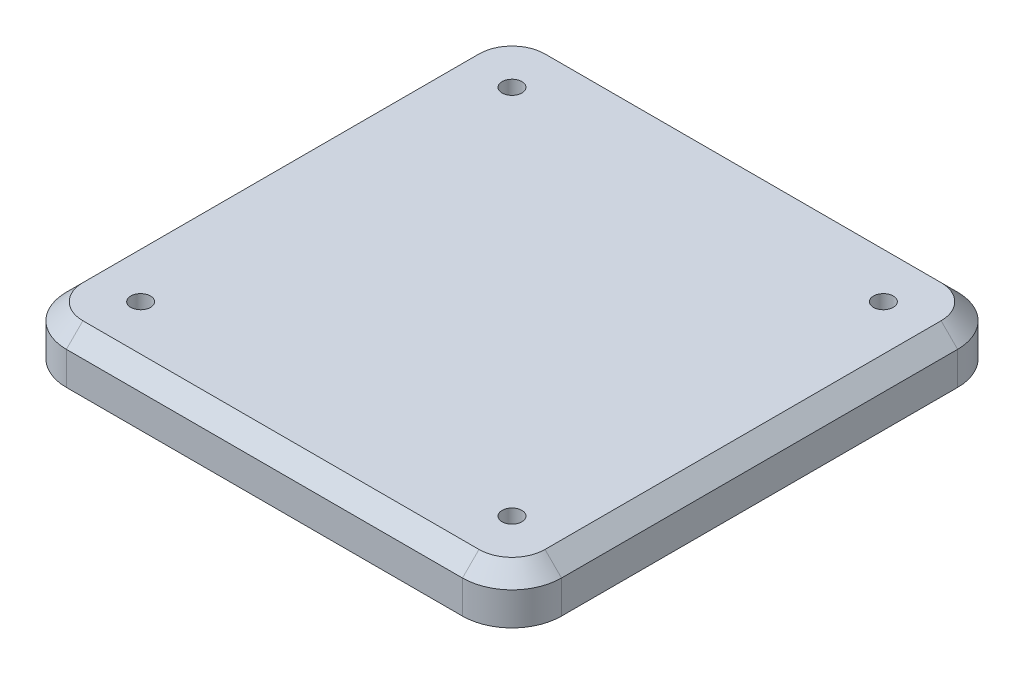
ISO-10303-21;
HEADER;
FILE_DESCRIPTION(('STEP AP214'),'2;1');
FILE_NAME('part.step','',(''),(''),'','','');
FILE_SCHEMA(('AUTOMOTIVE_DESIGN { 1 0 10303 214 1 1 1 1 }'));
ENDSEC;
DATA;
#1=APPLICATION_CONTEXT('core data for automotive mechanical design processes');
#2=APPLICATION_PROTOCOL_DEFINITION('international standard','automotive_design',2000,#1);
#3=PRODUCT_CONTEXT('',#1,'mechanical');
#4=PRODUCT('Part','Part','',(#3));
#5=PRODUCT_RELATED_PRODUCT_CATEGORY('part','',(#4));
#6=PRODUCT_DEFINITION_FORMATION('','',#4);
#7=PRODUCT_DEFINITION_CONTEXT('part definition',#1,'design');
#8=PRODUCT_DEFINITION('design','',#6,#7);
#9=PRODUCT_DEFINITION_SHAPE('','',#8);
#10=(LENGTH_UNIT() NAMED_UNIT(*) SI_UNIT(.MILLI.,.METRE.));
#11=(NAMED_UNIT(*) PLANE_ANGLE_UNIT() SI_UNIT($,.RADIAN.));
#12=(NAMED_UNIT(*) SI_UNIT($,.STERADIAN.) SOLID_ANGLE_UNIT());
#13=UNCERTAINTY_MEASURE_WITH_UNIT(LENGTH_MEASURE(1.E-05),#10,'distance_accuracy_value','');
#14=(GEOMETRIC_REPRESENTATION_CONTEXT(3) GLOBAL_UNCERTAINTY_ASSIGNED_CONTEXT((#13)) GLOBAL_UNIT_ASSIGNED_CONTEXT((#10,
#11,#12)) REPRESENTATION_CONTEXT('',''));
#15=CARTESIAN_POINT('',(0.,0.,0.));
#16=DIRECTION('',(0.,0.,1.));
#17=DIRECTION('',(1.,0.,0.));
#18=AXIS2_PLACEMENT_3D('',#15,#16,#17);
#19=CARTESIAN_POINT('',(0.,30.,0.));
#20=DIRECTION('',(0.,-1.,0.));
#21=DIRECTION('',(0.,0.,-1.));
#22=AXIS2_PLACEMENT_3D('',#19,#20,#21);
#23=PLANE('',#22);
#24=CARTESIAN_POINT('',(37.5,30.,-37.5));
#25=DIRECTION('',(0.,1.,0.));
#26=DIRECTION('',(0.,0.,1.));
#27=AXIS2_PLACEMENT_3D('',#24,#25,#26);
#28=CIRCLE('',#27,5.99999999999998);
#29=CARTESIAN_POINT('',(37.5,30.,-31.5));
#30=VERTEX_POINT('',#29);
#31=EDGE_CURVE('E156',#30,#30,#28,.T.);
#32=ORIENTED_EDGE('',*,*,#31,.F.);
#33=EDGE_LOOP('',(#32));
#34=FACE_BOUND('',#33,.T.);
#35=CARTESIAN_POINT('',(37.5,30.,-262.5));
#36=DIRECTION('',(0.,1.,0.));
#37=DIRECTION('',(0.,0.,1.));
#38=AXIS2_PLACEMENT_3D('',#35,#36,#37);
#39=CIRCLE('',#38,5.99999999999998);
#40=CARTESIAN_POINT('',(37.5,30.,-256.5));
#41=VERTEX_POINT('',#40);
#42=EDGE_CURVE('E155',#41,#41,#39,.T.);
#43=ORIENTED_EDGE('',*,*,#42,.F.);
#44=EDGE_LOOP('',(#43));
#45=FACE_BOUND('',#44,.T.);
#46=CARTESIAN_POINT('',(262.5,30.,-262.5));
#47=DIRECTION('',(0.,1.,0.));
#48=DIRECTION('',(0.,0.,1.));
#49=AXIS2_PLACEMENT_3D('',#46,#47,#48);
#50=CIRCLE('',#49,6.00000000000001);
#51=CARTESIAN_POINT('',(262.5,30.,-256.5));
#52=VERTEX_POINT('',#51);
#53=EDGE_CURVE('E166',#52,#52,#50,.T.);
#54=ORIENTED_EDGE('',*,*,#53,.F.);
#55=EDGE_LOOP('',(#54));
#56=FACE_BOUND('',#55,.T.);
#57=CARTESIAN_POINT('',(30.,30.,-270.));
#58=DIRECTION('',(0.,-1.,0.));
#59=DIRECTION('',(0.,0.,-1.));
#60=AXIS2_PLACEMENT_3D('',#57,#58,#59);
#61=CIRCLE('',#60,20.);
#62=CARTESIAN_POINT('',(30.,30.,-290.));
#63=VERTEX_POINT('',#62);
#64=CARTESIAN_POINT('',(9.99999999999995,30.,-270.));
#65=VERTEX_POINT('',#64);
#66=EDGE_CURVE('E252',#63,#65,#61,.F.);
#67=ORIENTED_EDGE('',*,*,#66,.T.);
#68=DIRECTION('',(0.,0.,1.));
#69=VECTOR('',#68,1.);
#70=CARTESIAN_POINT('',(9.99999999999995,30.,0.));
#71=LINE('',#70,#69);
#72=CARTESIAN_POINT('',(9.99999999999995,30.,-30.));
#73=VERTEX_POINT('',#72);
#74=EDGE_CURVE('E256',#65,#73,#71,.T.);
#75=ORIENTED_EDGE('',*,*,#74,.T.);
#76=CARTESIAN_POINT('',(30.,30.,-30.));
#77=DIRECTION('',(0.,-1.,0.));
#78=DIRECTION('',(0.,0.,-1.));
#79=AXIS2_PLACEMENT_3D('',#76,#77,#78);
#80=CIRCLE('',#79,20.);
#81=CARTESIAN_POINT('',(30.,30.,-9.99999999999995));
#82=VERTEX_POINT('',#81);
#83=EDGE_CURVE('E254',#73,#82,#80,.F.);
#84=ORIENTED_EDGE('',*,*,#83,.T.);
#85=DIRECTION('',(1.,0.,0.));
#86=VECTOR('',#85,1.);
#87=CARTESIAN_POINT('',(0.,30.,-9.99999999999995));
#88=LINE('',#87,#86);
#89=CARTESIAN_POINT('',(270.,30.,-9.99999999999998));
#90=VERTEX_POINT('',#89);
#91=EDGE_CURVE('E250',#82,#90,#88,.T.);
#92=ORIENTED_EDGE('',*,*,#91,.T.);
#93=CARTESIAN_POINT('',(270.,30.,-30.));
#94=DIRECTION('',(0.,-1.,0.));
#95=DIRECTION('',(0.,0.,-1.));
#96=AXIS2_PLACEMENT_3D('',#93,#94,#95);
#97=CIRCLE('',#96,20.);
#98=CARTESIAN_POINT('',(290.,30.,-30.));
#99=VERTEX_POINT('',#98);
#100=EDGE_CURVE('E246',#90,#99,#97,.F.);
#101=ORIENTED_EDGE('',*,*,#100,.T.);
#102=DIRECTION('',(0.,0.,-1.));
#103=VECTOR('',#102,1.);
#104=CARTESIAN_POINT('',(290.,30.,0.));
#105=LINE('',#104,#103);
#106=CARTESIAN_POINT('',(290.,30.,-270.));
#107=VERTEX_POINT('',#106);
#108=EDGE_CURVE('E242',#99,#107,#105,.T.);
#109=ORIENTED_EDGE('',*,*,#108,.T.);
#110=CARTESIAN_POINT('',(270.,30.,-270.));
#111=DIRECTION('',(0.,-1.,0.));
#112=DIRECTION('',(0.,0.,-1.));
#113=AXIS2_PLACEMENT_3D('',#110,#111,#112);
#114=CIRCLE('',#113,20.);
#115=CARTESIAN_POINT('',(270.,30.,-290.));
#116=VERTEX_POINT('',#115);
#117=EDGE_CURVE('E244',#107,#116,#114,.F.);
#118=ORIENTED_EDGE('',*,*,#117,.T.);
#119=DIRECTION('',(-1.,0.,0.));
#120=VECTOR('',#119,1.);
#121=CARTESIAN_POINT('',(0.,30.,-290.));
#122=LINE('',#121,#120);
#123=EDGE_CURVE('E248',#116,#63,#122,.T.);
#124=ORIENTED_EDGE('',*,*,#123,.T.);
#125=EDGE_LOOP('',(#67,#75,#84,#92,#101,#109,#118,#124));
#126=FACE_BOUND('',#125,.T.);
#127=CARTESIAN_POINT('',(262.5,30.,-37.5));
#128=DIRECTION('',(0.,1.,0.));
#129=DIRECTION('',(0.,0.,1.));
#130=AXIS2_PLACEMENT_3D('',#127,#128,#129);
#131=CIRCLE('',#130,6.00000000000001);
#132=CARTESIAN_POINT('',(262.5,30.,-31.5));
#133=VERTEX_POINT('',#132);
#134=EDGE_CURVE('E172',#133,#133,#131,.T.);
#135=ORIENTED_EDGE('',*,*,#134,.F.);
#136=EDGE_LOOP('',(#135));
#137=FACE_BOUND('',#136,.T.);
#138=ADVANCED_FACE('F33',(#34,#45,#56,#126,#137),#23,.F.);
#139=CARTESIAN_POINT('',(0.,30.,0.));
#140=DIRECTION('',(1.,0.,0.));
#141=DIRECTION('',(0.,0.,-1.));
#142=AXIS2_PLACEMENT_3D('',#139,#140,#141);
#143=PLANE('',#142);
#144=DIRECTION('',(0.,-1.,0.));
#145=VECTOR('',#144,1.);
#146=CARTESIAN_POINT('',(0.,30.,-30.));
#147=LINE('',#146,#145);
#148=CARTESIAN_POINT('',(0.,0.,-30.));
#149=VERTEX_POINT('',#148);
#150=CARTESIAN_POINT('',(0.,20.,-30.));
#151=VERTEX_POINT('',#150);
#152=EDGE_CURVE('E215',#149,#151,#147,.F.);
#153=ORIENTED_EDGE('',*,*,#152,.T.);
#154=DIRECTION('',(0.,0.,-1.));
#155=VECTOR('',#154,1.);
#156=CARTESIAN_POINT('',(0.,20.,0.));
#157=LINE('',#156,#155);
#158=CARTESIAN_POINT('',(0.,20.,-270.));
#159=VERTEX_POINT('',#158);
#160=EDGE_CURVE('E259',#151,#159,#157,.T.);
#161=ORIENTED_EDGE('',*,*,#160,.T.);
#162=DIRECTION('',(0.,-1.,0.));
#163=VECTOR('',#162,1.);
#164=CARTESIAN_POINT('',(0.,30.,-270.));
#165=LINE('',#164,#163);
#166=CARTESIAN_POINT('',(0.,0.,-270.));
#167=VERTEX_POINT('',#166);
#168=EDGE_CURVE('E218',#159,#167,#165,.T.);
#169=ORIENTED_EDGE('',*,*,#168,.T.);
#170=DIRECTION('',(0.,0.,1.));
#171=VECTOR('',#170,1.);
#172=CARTESIAN_POINT('',(0.,0.,0.));
#173=LINE('',#172,#171);
#174=EDGE_CURVE('E203',#167,#149,#173,.T.);
#175=ORIENTED_EDGE('',*,*,#174,.T.);
#176=EDGE_LOOP('',(#153,#161,#169,#175));
#177=FACE_BOUND('',#176,.T.);
#178=ADVANCED_FACE('F338',(#177),#143,.F.);
#179=CARTESIAN_POINT('',(0.,30.,0.));
#180=DIRECTION('',(0.,0.,-1.));
#181=DIRECTION('',(-1.,0.,0.));
#182=AXIS2_PLACEMENT_3D('',#179,#180,#181);
#183=PLANE('',#182);
#184=DIRECTION('',(0.,-1.,0.));
#185=VECTOR('',#184,1.);
#186=CARTESIAN_POINT('',(270.,30.,0.));
#187=LINE('',#186,#185);
#188=CARTESIAN_POINT('',(270.,0.,0.));
#189=VERTEX_POINT('',#188);
#190=CARTESIAN_POINT('',(270.,20.,0.));
#191=VERTEX_POINT('',#190);
#192=EDGE_CURVE('E239',#189,#191,#187,.F.);
#193=ORIENTED_EDGE('',*,*,#192,.T.);
#194=DIRECTION('',(-1.,0.,0.));
#195=VECTOR('',#194,1.);
#196=CARTESIAN_POINT('',(0.,20.,0.));
#197=LINE('',#196,#195);
#198=CARTESIAN_POINT('',(30.,20.,0.));
#199=VERTEX_POINT('',#198);
#200=EDGE_CURVE('E266',#191,#199,#197,.T.);
#201=ORIENTED_EDGE('',*,*,#200,.T.);
#202=DIRECTION('',(0.,-1.,0.));
#203=VECTOR('',#202,1.);
#204=CARTESIAN_POINT('',(30.,30.,0.));
#205=LINE('',#204,#203);
#206=CARTESIAN_POINT('',(30.,0.,0.));
#207=VERTEX_POINT('',#206);
#208=EDGE_CURVE('E237',#199,#207,#205,.T.);
#209=ORIENTED_EDGE('',*,*,#208,.T.);
#210=DIRECTION('',(1.,0.,0.));
#211=VECTOR('',#210,1.);
#212=CARTESIAN_POINT('',(0.,0.,0.));
#213=LINE('',#212,#211);
#214=EDGE_CURVE('E206',#207,#189,#213,.T.);
#215=ORIENTED_EDGE('',*,*,#214,.T.);
#216=EDGE_LOOP('',(#193,#201,#209,#215));
#217=FACE_BOUND('',#216,.T.);
#218=ADVANCED_FACE('F309',(#217),#183,.F.);
#219=CARTESIAN_POINT('',(300.,30.,0.));
#220=DIRECTION('',(-1.,0.,0.));
#221=DIRECTION('',(0.,0.,1.));
#222=AXIS2_PLACEMENT_3D('',#219,#220,#221);
#223=PLANE('',#222);
#224=DIRECTION('',(0.,-1.,0.));
#225=VECTOR('',#224,1.);
#226=CARTESIAN_POINT('',(300.,30.,-270.));
#227=LINE('',#226,#225);
#228=CARTESIAN_POINT('',(300.,0.,-270.));
#229=VERTEX_POINT('',#228);
#230=CARTESIAN_POINT('',(300.,20.,-270.));
#231=VERTEX_POINT('',#230);
#232=EDGE_CURVE('E235',#229,#231,#227,.F.);
#233=ORIENTED_EDGE('',*,*,#232,.T.);
#234=DIRECTION('',(0.,0.,1.));
#235=VECTOR('',#234,1.);
#236=CARTESIAN_POINT('',(300.,20.,0.));
#237=LINE('',#236,#235);
#238=CARTESIAN_POINT('',(300.,20.,-30.));
#239=VERTEX_POINT('',#238);
#240=EDGE_CURVE('E11',#231,#239,#237,.T.);
#241=ORIENTED_EDGE('',*,*,#240,.T.);
#242=DIRECTION('',(0.,-1.,0.));
#243=VECTOR('',#242,1.);
#244=CARTESIAN_POINT('',(300.,30.,-30.));
#245=LINE('',#244,#243);
#246=CARTESIAN_POINT('',(300.,0.,-30.));
#247=VERTEX_POINT('',#246);
#248=EDGE_CURVE('E233',#239,#247,#245,.T.);
#249=ORIENTED_EDGE('',*,*,#248,.T.);
#250=DIRECTION('',(0.,0.,-1.));
#251=VECTOR('',#250,1.);
#252=CARTESIAN_POINT('',(300.,0.,0.));
#253=LINE('',#252,#251);
#254=EDGE_CURVE('E209',#247,#229,#253,.T.);
#255=ORIENTED_EDGE('',*,*,#254,.T.);
#256=EDGE_LOOP('',(#233,#241,#249,#255));
#257=FACE_BOUND('',#256,.T.);
#258=ADVANCED_FACE('F319',(#257),#223,.F.);
#259=CARTESIAN_POINT('',(0.,30.,-300.));
#260=DIRECTION('',(0.,0.,1.));
#261=DIRECTION('',(1.,0.,0.));
#262=AXIS2_PLACEMENT_3D('',#259,#260,#261);
#263=PLANE('',#262);
#264=DIRECTION('',(0.,-1.,0.));
#265=VECTOR('',#264,1.);
#266=CARTESIAN_POINT('',(30.,30.,-300.));
#267=LINE('',#266,#265);
#268=CARTESIAN_POINT('',(30.,0.,-300.));
#269=VERTEX_POINT('',#268);
#270=CARTESIAN_POINT('',(30.,20.,-300.));
#271=VERTEX_POINT('',#270);
#272=EDGE_CURVE('E230',#269,#271,#267,.F.);
#273=ORIENTED_EDGE('',*,*,#272,.T.);
#274=DIRECTION('',(1.,0.,0.));
#275=VECTOR('',#274,1.);
#276=CARTESIAN_POINT('',(0.,20.,-300.));
#277=LINE('',#276,#275);
#278=CARTESIAN_POINT('',(270.,20.,-300.));
#279=VERTEX_POINT('',#278);
#280=EDGE_CURVE('E268',#271,#279,#277,.T.);
#281=ORIENTED_EDGE('',*,*,#280,.T.);
#282=DIRECTION('',(0.,-1.,0.));
#283=VECTOR('',#282,1.);
#284=CARTESIAN_POINT('',(270.,30.,-300.));
#285=LINE('',#284,#283);
#286=CARTESIAN_POINT('',(270.,0.,-300.));
#287=VERTEX_POINT('',#286);
#288=EDGE_CURVE('E228',#279,#287,#285,.T.);
#289=ORIENTED_EDGE('',*,*,#288,.T.);
#290=DIRECTION('',(-1.,0.,0.));
#291=VECTOR('',#290,1.);
#292=CARTESIAN_POINT('',(0.,0.,-300.));
#293=LINE('',#292,#291);
#294=EDGE_CURVE('E212',#287,#269,#293,.T.);
#295=ORIENTED_EDGE('',*,*,#294,.T.);
#296=EDGE_LOOP('',(#273,#281,#289,#295));
#297=FACE_BOUND('',#296,.T.);
#298=ADVANCED_FACE('F324',(#297),#263,.F.);
#299=CARTESIAN_POINT('',(0.,0.,0.));
#300=DIRECTION('',(0.,-1.,0.));
#301=DIRECTION('',(0.,0.,-1.));
#302=AXIS2_PLACEMENT_3D('',#299,#300,#301);
#303=PLANE('',#302);
#304=CARTESIAN_POINT('',(25.,0.,-25.));
#305=DIRECTION('',(0.,-1.,0.));
#306=DIRECTION('',(0.,0.,-1.));
#307=AXIS2_PLACEMENT_3D('',#304,#305,#306);
#308=CIRCLE('',#307,5.99999999999999);
#309=CARTESIAN_POINT('',(25.,0.,-31.));
#310=VERTEX_POINT('',#309);
#311=EDGE_CURVE('E178',#310,#310,#308,.T.);
#312=ORIENTED_EDGE('',*,*,#311,.F.);
#313=EDGE_LOOP('',(#312));
#314=FACE_BOUND('',#313,.T.);
#315=CARTESIAN_POINT('',(275.,0.,-25.));
#316=DIRECTION('',(0.,-1.,0.));
#317=DIRECTION('',(0.,0.,-1.));
#318=AXIS2_PLACEMENT_3D('',#315,#316,#317);
#319=CIRCLE('',#318,6.00000000000001);
#320=CARTESIAN_POINT('',(275.,0.,-31.));
#321=VERTEX_POINT('',#320);
#322=EDGE_CURVE('E184',#321,#321,#319,.T.);
#323=ORIENTED_EDGE('',*,*,#322,.F.);
#324=EDGE_LOOP('',(#323));
#325=FACE_BOUND('',#324,.T.);
#326=CARTESIAN_POINT('',(275.,0.,-275.));
#327=DIRECTION('',(0.,-1.,0.));
#328=DIRECTION('',(0.,0.,-1.));
#329=AXIS2_PLACEMENT_3D('',#326,#327,#328);
#330=CIRCLE('',#329,6.00000000000001);
#331=CARTESIAN_POINT('',(275.,0.,-281.));
#332=VERTEX_POINT('',#331);
#333=EDGE_CURVE('E190',#332,#332,#330,.T.);
#334=ORIENTED_EDGE('',*,*,#333,.F.);
#335=EDGE_LOOP('',(#334));
#336=FACE_BOUND('',#335,.T.);
#337=CARTESIAN_POINT('',(25.,0.,-275.));
#338=DIRECTION('',(0.,-1.,0.));
#339=DIRECTION('',(0.,0.,-1.));
#340=AXIS2_PLACEMENT_3D('',#337,#338,#339);
#341=CIRCLE('',#340,5.99999999999999);
#342=CARTESIAN_POINT('',(25.,0.,-281.));
#343=VERTEX_POINT('',#342);
#344=EDGE_CURVE('E196',#343,#343,#341,.T.);
#345=ORIENTED_EDGE('',*,*,#344,.F.);
#346=EDGE_LOOP('',(#345));
#347=FACE_BOUND('',#346,.T.);
#348=ORIENTED_EDGE('',*,*,#174,.F.);
#349=CARTESIAN_POINT('',(30.,0.,-270.));
#350=DIRECTION('',(0.,-1.,0.));
#351=DIRECTION('',(0.,0.,-1.));
#352=AXIS2_PLACEMENT_3D('',#349,#350,#351);
#353=CIRCLE('',#352,30.);
#354=EDGE_CURVE('E226',#167,#269,#353,.T.);
#355=ORIENTED_EDGE('',*,*,#354,.T.);
#356=ORIENTED_EDGE('',*,*,#294,.F.);
#357=CARTESIAN_POINT('',(270.,0.,-270.));
#358=DIRECTION('',(0.,-1.,0.));
#359=DIRECTION('',(0.,0.,-1.));
#360=AXIS2_PLACEMENT_3D('',#357,#358,#359);
#361=CIRCLE('',#360,30.);
#362=EDGE_CURVE('E224',#287,#229,#361,.T.);
#363=ORIENTED_EDGE('',*,*,#362,.T.);
#364=ORIENTED_EDGE('',*,*,#254,.F.);
#365=CARTESIAN_POINT('',(270.,0.,-30.));
#366=DIRECTION('',(0.,-1.,0.));
#367=DIRECTION('',(0.,0.,-1.));
#368=AXIS2_PLACEMENT_3D('',#365,#366,#367);
#369=CIRCLE('',#368,30.);
#370=EDGE_CURVE('E222',#247,#189,#369,.T.);
#371=ORIENTED_EDGE('',*,*,#370,.T.);
#372=ORIENTED_EDGE('',*,*,#214,.F.);
#373=CARTESIAN_POINT('',(30.,0.,-30.));
#374=DIRECTION('',(0.,-1.,0.));
#375=DIRECTION('',(0.,0.,-1.));
#376=AXIS2_PLACEMENT_3D('',#373,#374,#375);
#377=CIRCLE('',#376,30.);
#378=EDGE_CURVE('E220',#207,#149,#377,.T.);
#379=ORIENTED_EDGE('',*,*,#378,.T.);
#380=EDGE_LOOP('',(#348,#355,#356,#363,#364,#371,#372,#379));
#381=FACE_BOUND('',#380,.T.);
#382=ADVANCED_FACE('F315',(#314,#325,#336,#347,#381),#303,.T.);
#383=CARTESIAN_POINT('',(30.,30.,-270.));
#384=DIRECTION('',(0.,-1.,0.));
#385=DIRECTION('',(0.,0.,-1.));
#386=AXIS2_PLACEMENT_3D('',#383,#384,#385);
#387=CYLINDRICAL_SURFACE('',#386,30.);
#388=ORIENTED_EDGE('',*,*,#168,.F.);
#389=CARTESIAN_POINT('',(30.,20.,-270.));
#390=DIRECTION('',(0.,-1.,0.));
#391=DIRECTION('',(0.,0.,-1.));
#392=AXIS2_PLACEMENT_3D('',#389,#390,#391);
#393=CIRCLE('',#392,30.);
#394=EDGE_CURVE('E264',#159,#271,#393,.T.);
#395=ORIENTED_EDGE('',*,*,#394,.T.);
#396=ORIENTED_EDGE('',*,*,#272,.F.);
#397=ORIENTED_EDGE('',*,*,#354,.F.);
#398=EDGE_LOOP('',(#388,#395,#396,#397));
#399=FACE_BOUND('',#398,.T.);
#400=ADVANCED_FACE('F328',(#399),#387,.T.);
#401=CARTESIAN_POINT('',(270.,30.,-270.));
#402=DIRECTION('',(0.,-1.,0.));
#403=DIRECTION('',(0.,0.,-1.));
#404=AXIS2_PLACEMENT_3D('',#401,#402,#403);
#405=CYLINDRICAL_SURFACE('',#404,30.);
#406=ORIENTED_EDGE('',*,*,#288,.F.);
#407=CARTESIAN_POINT('',(270.,20.,-270.));
#408=DIRECTION('',(0.,-1.,0.));
#409=DIRECTION('',(0.,0.,-1.));
#410=AXIS2_PLACEMENT_3D('',#407,#408,#409);
#411=CIRCLE('',#410,30.);
#412=EDGE_CURVE('E42',#279,#231,#411,.T.);
#413=ORIENTED_EDGE('',*,*,#412,.T.);
#414=ORIENTED_EDGE('',*,*,#232,.F.);
#415=ORIENTED_EDGE('',*,*,#362,.F.);
#416=EDGE_LOOP('',(#406,#413,#414,#415));
#417=FACE_BOUND('',#416,.T.);
#418=ADVANCED_FACE('F320',(#417),#405,.T.);
#419=CARTESIAN_POINT('',(270.,30.,-30.));
#420=DIRECTION('',(0.,-1.,0.));
#421=DIRECTION('',(0.,0.,-1.));
#422=AXIS2_PLACEMENT_3D('',#419,#420,#421);
#423=CYLINDRICAL_SURFACE('',#422,30.);
#424=ORIENTED_EDGE('',*,*,#248,.F.);
#425=CARTESIAN_POINT('',(270.,20.,-30.));
#426=DIRECTION('',(0.,-1.,0.));
#427=DIRECTION('',(0.,0.,-1.));
#428=AXIS2_PLACEMENT_3D('',#425,#426,#427);
#429=CIRCLE('',#428,30.);
#430=EDGE_CURVE('E270',#239,#191,#429,.T.);
#431=ORIENTED_EDGE('',*,*,#430,.T.);
#432=ORIENTED_EDGE('',*,*,#192,.F.);
#433=ORIENTED_EDGE('',*,*,#370,.F.);
#434=EDGE_LOOP('',(#424,#431,#432,#433));
#435=FACE_BOUND('',#434,.T.);
#436=ADVANCED_FACE('F306',(#435),#423,.T.);
#437=CARTESIAN_POINT('',(30.,30.,-30.));
#438=DIRECTION('',(0.,-1.,0.));
#439=DIRECTION('',(0.,0.,-1.));
#440=AXIS2_PLACEMENT_3D('',#437,#438,#439);
#441=CYLINDRICAL_SURFACE('',#440,30.);
#442=ORIENTED_EDGE('',*,*,#208,.F.);
#443=CARTESIAN_POINT('',(30.,20.,-30.));
#444=DIRECTION('',(0.,-1.,0.));
#445=DIRECTION('',(0.,0.,-1.));
#446=AXIS2_PLACEMENT_3D('',#443,#444,#445);
#447=CIRCLE('',#446,30.);
#448=EDGE_CURVE('E262',#199,#151,#447,.T.);
#449=ORIENTED_EDGE('',*,*,#448,.T.);
#450=ORIENTED_EDGE('',*,*,#152,.F.);
#451=ORIENTED_EDGE('',*,*,#378,.F.);
#452=EDGE_LOOP('',(#442,#449,#450,#451));
#453=FACE_BOUND('',#452,.T.);
#454=ADVANCED_FACE('F392',(#453),#441,.T.);
#455=CARTESIAN_POINT('',(290.,30.,0.));
#456=DIRECTION('',(-0.707106781186549,-0.707106781186546,0.));
#457=DIRECTION('',(0.,0.,-1.));
#458=AXIS2_PLACEMENT_3D('',#455,#456,#457);
#459=PLANE('',#458);
#460=DIRECTION('',(-0.707106781186546,0.707106781186549,0.));
#461=VECTOR('',#460,1.);
#462=CARTESIAN_POINT('',(300.,20.,-30.));
#463=LINE('',#462,#461);
#464=EDGE_CURVE('E287',#239,#99,#463,.T.);
#465=ORIENTED_EDGE('',*,*,#464,.F.);
#466=ORIENTED_EDGE('',*,*,#240,.F.);
#467=DIRECTION('',(0.707106781186546,-0.707106781186549,0.));
#468=VECTOR('',#467,1.);
#469=CARTESIAN_POINT('',(290.,30.,-270.));
#470=LINE('',#469,#468);
#471=EDGE_CURVE('E37',#107,#231,#470,.T.);
#472=ORIENTED_EDGE('',*,*,#471,.F.);
#473=ORIENTED_EDGE('',*,*,#108,.F.);
#474=EDGE_LOOP('',(#465,#466,#472,#473));
#475=FACE_BOUND('',#474,.T.);
#476=ADVANCED_FACE('F35',(#475),#459,.F.);
#477=CARTESIAN_POINT('',(270.,30.,-270.));
#478=DIRECTION('',(0.,-1.,0.));
#479=DIRECTION('',(0.,0.,-1.));
#480=AXIS2_PLACEMENT_3D('',#477,#478,#479);
#481=CONICAL_SURFACE('',#480,20.,0.785398163397447);
#482=ORIENTED_EDGE('',*,*,#471,.T.);
#483=ORIENTED_EDGE('',*,*,#412,.F.);
#484=DIRECTION('',(0.,-0.707106781186549,-0.707106781186546));
#485=VECTOR('',#484,1.);
#486=CARTESIAN_POINT('',(270.,30.,-290.));
#487=LINE('',#486,#485);
#488=EDGE_CURVE('E285',#116,#279,#487,.T.);
#489=ORIENTED_EDGE('',*,*,#488,.F.);
#490=ORIENTED_EDGE('',*,*,#117,.F.);
#491=EDGE_LOOP('',(#482,#483,#489,#490));
#492=FACE_BOUND('',#491,.T.);
#493=ADVANCED_FACE('F297',(#492),#481,.T.);
#494=CARTESIAN_POINT('',(270.,30.,-30.));
#495=DIRECTION('',(0.,-1.,0.));
#496=DIRECTION('',(0.,0.,-1.));
#497=AXIS2_PLACEMENT_3D('',#494,#495,#496);
#498=CONICAL_SURFACE('',#497,20.,0.785398163397447);
#499=ORIENTED_EDGE('',*,*,#464,.T.);
#500=ORIENTED_EDGE('',*,*,#100,.F.);
#501=DIRECTION('',(0.,0.707106781186548,-0.707106781186546));
#502=VECTOR('',#501,1.);
#503=CARTESIAN_POINT('',(270.,20.,0.));
#504=LINE('',#503,#502);
#505=EDGE_CURVE('E282',#191,#90,#504,.T.);
#506=ORIENTED_EDGE('',*,*,#505,.F.);
#507=ORIENTED_EDGE('',*,*,#430,.F.);
#508=EDGE_LOOP('',(#499,#500,#506,#507));
#509=FACE_BOUND('',#508,.T.);
#510=ADVANCED_FACE('F302',(#509),#498,.T.);
#511=CARTESIAN_POINT('',(0.,30.,-290.));
#512=DIRECTION('',(0.,-0.707106781186546,0.707106781186549));
#513=DIRECTION('',(-1.,0.,0.));
#514=AXIS2_PLACEMENT_3D('',#511,#512,#513);
#515=PLANE('',#514);
#516=ORIENTED_EDGE('',*,*,#488,.T.);
#517=ORIENTED_EDGE('',*,*,#280,.F.);
#518=DIRECTION('',(0.,-0.707106781186549,-0.707106781186546));
#519=VECTOR('',#518,1.);
#520=CARTESIAN_POINT('',(30.,30.,-290.));
#521=LINE('',#520,#519);
#522=EDGE_CURVE('E279',#63,#271,#521,.T.);
#523=ORIENTED_EDGE('',*,*,#522,.F.);
#524=ORIENTED_EDGE('',*,*,#123,.F.);
#525=EDGE_LOOP('',(#516,#517,#523,#524));
#526=FACE_BOUND('',#525,.T.);
#527=ADVANCED_FACE('F353',(#526),#515,.F.);
#528=CARTESIAN_POINT('',(0.,30.,-9.99999999999995));
#529=DIRECTION('',(0.,-0.707106781186546,-0.707106781186549));
#530=DIRECTION('',(1.,0.,0.));
#531=AXIS2_PLACEMENT_3D('',#528,#529,#530);
#532=PLANE('',#531);
#533=ORIENTED_EDGE('',*,*,#505,.T.);
#534=ORIENTED_EDGE('',*,*,#91,.F.);
#535=DIRECTION('',(0.,0.707106781186549,-0.707106781186546));
#536=VECTOR('',#535,1.);
#537=CARTESIAN_POINT('',(30.,20.,0.));
#538=LINE('',#537,#536);
#539=EDGE_CURVE('E276',#199,#82,#538,.T.);
#540=ORIENTED_EDGE('',*,*,#539,.F.);
#541=ORIENTED_EDGE('',*,*,#200,.F.);
#542=EDGE_LOOP('',(#533,#534,#540,#541));
#543=FACE_BOUND('',#542,.T.);
#544=ADVANCED_FACE('F355',(#543),#532,.F.);
#545=CARTESIAN_POINT('',(30.,30.,-270.));
#546=DIRECTION('',(0.,-1.,0.));
#547=DIRECTION('',(0.,0.,-1.));
#548=AXIS2_PLACEMENT_3D('',#545,#546,#547);
#549=CONICAL_SURFACE('',#548,20.,0.785398163397446);
#550=ORIENTED_EDGE('',*,*,#522,.T.);
#551=ORIENTED_EDGE('',*,*,#394,.F.);
#552=DIRECTION('',(-0.707106781186545,-0.70710678118655,0.));
#553=VECTOR('',#552,1.);
#554=CARTESIAN_POINT('',(9.99999999999995,30.,-270.));
#555=LINE('',#554,#553);
#556=EDGE_CURVE('E274',#65,#159,#555,.T.);
#557=ORIENTED_EDGE('',*,*,#556,.F.);
#558=ORIENTED_EDGE('',*,*,#66,.F.);
#559=EDGE_LOOP('',(#550,#551,#557,#558));
#560=FACE_BOUND('',#559,.T.);
#561=ADVANCED_FACE('F332',(#560),#549,.T.);
#562=CARTESIAN_POINT('',(30.,30.,-30.));
#563=DIRECTION('',(0.,-1.,0.));
#564=DIRECTION('',(0.,0.,-1.));
#565=AXIS2_PLACEMENT_3D('',#562,#563,#564);
#566=CONICAL_SURFACE('',#565,20.,0.785398163397446);
#567=ORIENTED_EDGE('',*,*,#539,.T.);
#568=ORIENTED_EDGE('',*,*,#83,.F.);
#569=DIRECTION('',(0.707106781186546,0.707106781186549,0.));
#570=VECTOR('',#569,1.);
#571=CARTESIAN_POINT('',(0.,20.,-30.));
#572=LINE('',#571,#570);
#573=EDGE_CURVE('E202',#151,#73,#572,.T.);
#574=ORIENTED_EDGE('',*,*,#573,.F.);
#575=ORIENTED_EDGE('',*,*,#448,.F.);
#576=EDGE_LOOP('',(#567,#568,#574,#575));
#577=FACE_BOUND('',#576,.T.);
#578=ADVANCED_FACE('F346',(#577),#566,.T.);
#579=CARTESIAN_POINT('',(9.99999999999995,30.,0.));
#580=DIRECTION('',(0.707106781186549,-0.707106781186546,0.));
#581=DIRECTION('',(0.,0.,1.));
#582=AXIS2_PLACEMENT_3D('',#579,#580,#581);
#583=PLANE('',#582);
#584=ORIENTED_EDGE('',*,*,#556,.T.);
#585=ORIENTED_EDGE('',*,*,#160,.F.);
#586=ORIENTED_EDGE('',*,*,#573,.T.);
#587=ORIENTED_EDGE('',*,*,#74,.F.);
#588=EDGE_LOOP('',(#584,#585,#586,#587));
#589=FACE_BOUND('',#588,.T.);
#590=ADVANCED_FACE('F342',(#589),#583,.F.);
#591=CARTESIAN_POINT('',(25.,9.99999999999999,-275.));
#592=DIRECTION('',(0.,-1.,0.));
#593=DIRECTION('',(0.,0.,-1.));
#594=AXIS2_PLACEMENT_3D('',#591,#592,#593);
#595=CONICAL_SURFACE('',#594,5.99999999999999,1.02974425867666);
#596=CARTESIAN_POINT('',(25.,13.6051637141653,-275.));
#597=VERTEX_POINT('',#596);
#598=VERTEX_LOOP('',#597);
#599=FACE_BOUND('',#598,.T.);
#600=CARTESIAN_POINT('',(25.,9.99999999999999,-275.));
#601=DIRECTION('',(0.,-1.,0.));
#602=DIRECTION('',(0.,0.,-1.));
#603=AXIS2_PLACEMENT_3D('',#600,#601,#602);
#604=CIRCLE('',#603,5.99999999999999);
#605=CARTESIAN_POINT('',(25.,9.99999999999999,-281.));
#606=VERTEX_POINT('',#605);
#607=EDGE_CURVE('E199',#606,#606,#604,.T.);
#608=ORIENTED_EDGE('',*,*,#607,.T.);
#609=EDGE_LOOP('',(#608));
#610=FACE_BOUND('',#609,.T.);
#611=ADVANCED_FACE('F375',(#599,#610),#595,.F.);
#612=CARTESIAN_POINT('',(25.,0.,-275.));
#613=DIRECTION('',(0.,-1.,0.));
#614=DIRECTION('',(0.,0.,-1.));
#615=AXIS2_PLACEMENT_3D('',#612,#613,#614);
#616=CYLINDRICAL_SURFACE('',#615,5.99999999999999);
#617=ORIENTED_EDGE('',*,*,#607,.F.);
#618=EDGE_LOOP('',(#617));
#619=FACE_BOUND('',#618,.T.);
#620=ORIENTED_EDGE('',*,*,#344,.T.);
#621=EDGE_LOOP('',(#620));
#622=FACE_BOUND('',#621,.T.);
#623=ADVANCED_FACE('F419',(#619,#622),#616,.F.);
#624=CARTESIAN_POINT('',(275.,9.99999999999999,-275.));
#625=DIRECTION('',(0.,-1.,0.));
#626=DIRECTION('',(0.,0.,-1.));
#627=AXIS2_PLACEMENT_3D('',#624,#625,#626);
#628=CONICAL_SURFACE('',#627,6.00000000000001,1.02974425867666);
#629=CARTESIAN_POINT('',(275.,13.6051637141653,-275.));
#630=VERTEX_POINT('',#629);
#631=VERTEX_LOOP('',#630);
#632=FACE_BOUND('',#631,.T.);
#633=CARTESIAN_POINT('',(275.,9.99999999999999,-275.));
#634=DIRECTION('',(0.,-1.,0.));
#635=DIRECTION('',(0.,0.,-1.));
#636=AXIS2_PLACEMENT_3D('',#633,#634,#635);
#637=CIRCLE('',#636,6.00000000000001);
#638=CARTESIAN_POINT('',(275.,9.99999999999999,-281.));
#639=VERTEX_POINT('',#638);
#640=EDGE_CURVE('E193',#639,#639,#637,.T.);
#641=ORIENTED_EDGE('',*,*,#640,.T.);
#642=EDGE_LOOP('',(#641));
#643=FACE_BOUND('',#642,.T.);
#644=ADVANCED_FACE('F427',(#632,#643),#628,.F.);
#645=CARTESIAN_POINT('',(275.,0.,-275.));
#646=DIRECTION('',(0.,-1.,0.));
#647=DIRECTION('',(0.,0.,-1.));
#648=AXIS2_PLACEMENT_3D('',#645,#646,#647);
#649=CYLINDRICAL_SURFACE('',#648,6.00000000000001);
#650=ORIENTED_EDGE('',*,*,#640,.F.);
#651=EDGE_LOOP('',(#650));
#652=FACE_BOUND('',#651,.T.);
#653=ORIENTED_EDGE('',*,*,#333,.T.);
#654=EDGE_LOOP('',(#653));
#655=FACE_BOUND('',#654,.T.);
#656=ADVANCED_FACE('F434',(#652,#655),#649,.F.);
#657=CARTESIAN_POINT('',(275.,9.99999999999999,-25.));
#658=DIRECTION('',(0.,-1.,0.));
#659=DIRECTION('',(0.,0.,-1.));
#660=AXIS2_PLACEMENT_3D('',#657,#658,#659);
#661=CONICAL_SURFACE('',#660,6.00000000000001,1.02974425867666);
#662=CARTESIAN_POINT('',(275.,13.6051637141653,-25.));
#663=VERTEX_POINT('',#662);
#664=VERTEX_LOOP('',#663);
#665=FACE_BOUND('',#664,.T.);
#666=CARTESIAN_POINT('',(275.,9.99999999999999,-25.));
#667=DIRECTION('',(0.,-1.,0.));
#668=DIRECTION('',(0.,0.,-1.));
#669=AXIS2_PLACEMENT_3D('',#666,#667,#668);
#670=CIRCLE('',#669,6.00000000000001);
#671=CARTESIAN_POINT('',(275.,9.99999999999999,-31.));
#672=VERTEX_POINT('',#671);
#673=EDGE_CURVE('E187',#672,#672,#670,.T.);
#674=ORIENTED_EDGE('',*,*,#673,.T.);
#675=EDGE_LOOP('',(#674));
#676=FACE_BOUND('',#675,.T.);
#677=ADVANCED_FACE('F442',(#665,#676),#661,.F.);
#678=CARTESIAN_POINT('',(275.,0.,-25.));
#679=DIRECTION('',(0.,-1.,0.));
#680=DIRECTION('',(0.,0.,-1.));
#681=AXIS2_PLACEMENT_3D('',#678,#679,#680);
#682=CYLINDRICAL_SURFACE('',#681,6.00000000000001);
#683=ORIENTED_EDGE('',*,*,#673,.F.);
#684=EDGE_LOOP('',(#683));
#685=FACE_BOUND('',#684,.T.);
#686=ORIENTED_EDGE('',*,*,#322,.T.);
#687=EDGE_LOOP('',(#686));
#688=FACE_BOUND('',#687,.T.);
#689=ADVANCED_FACE('F450',(#685,#688),#682,.F.);
#690=CARTESIAN_POINT('',(25.,9.99999999999999,-25.));
#691=DIRECTION('',(0.,-1.,0.));
#692=DIRECTION('',(0.,0.,-1.));
#693=AXIS2_PLACEMENT_3D('',#690,#691,#692);
#694=CONICAL_SURFACE('',#693,5.99999999999999,1.02974425867666);
#695=CARTESIAN_POINT('',(25.,13.6051637141653,-25.));
#696=VERTEX_POINT('',#695);
#697=VERTEX_LOOP('',#696);
#698=FACE_BOUND('',#697,.T.);
#699=CARTESIAN_POINT('',(25.,9.99999999999999,-25.));
#700=DIRECTION('',(0.,-1.,0.));
#701=DIRECTION('',(0.,0.,-1.));
#702=AXIS2_PLACEMENT_3D('',#699,#700,#701);
#703=CIRCLE('',#702,5.99999999999999);
#704=CARTESIAN_POINT('',(25.,9.99999999999999,-31.));
#705=VERTEX_POINT('',#704);
#706=EDGE_CURVE('E181',#705,#705,#703,.T.);
#707=ORIENTED_EDGE('',*,*,#706,.T.);
#708=EDGE_LOOP('',(#707));
#709=FACE_BOUND('',#708,.T.);
#710=ADVANCED_FACE('F458',(#698,#709),#694,.F.);
#711=CARTESIAN_POINT('',(25.,0.,-25.));
#712=DIRECTION('',(0.,-1.,0.));
#713=DIRECTION('',(0.,0.,-1.));
#714=AXIS2_PLACEMENT_3D('',#711,#712,#713);
#715=CYLINDRICAL_SURFACE('',#714,5.99999999999999);
#716=ORIENTED_EDGE('',*,*,#706,.F.);
#717=EDGE_LOOP('',(#716));
#718=FACE_BOUND('',#717,.T.);
#719=ORIENTED_EDGE('',*,*,#311,.T.);
#720=EDGE_LOOP('',(#719));
#721=FACE_BOUND('',#720,.T.);
#722=ADVANCED_FACE('F466',(#718,#721),#715,.F.);
#723=CARTESIAN_POINT('',(262.5,20.,-37.5));
#724=DIRECTION('',(0.,1.,0.));
#725=DIRECTION('',(0.,0.,1.));
#726=AXIS2_PLACEMENT_3D('',#723,#724,#725);
#727=CONICAL_SURFACE('',#726,6.00000000000001,1.02974425867666);
#728=CARTESIAN_POINT('',(262.5,16.3948362858347,-37.5));
#729=VERTEX_POINT('',#728);
#730=VERTEX_LOOP('',#729);
#731=FACE_BOUND('',#730,.T.);
#732=CARTESIAN_POINT('',(262.5,20.,-37.5));
#733=DIRECTION('',(0.,1.,0.));
#734=DIRECTION('',(0.,0.,1.));
#735=AXIS2_PLACEMENT_3D('',#732,#733,#734);
#736=CIRCLE('',#735,6.00000000000001);
#737=CARTESIAN_POINT('',(262.5,20.,-31.5));
#738=VERTEX_POINT('',#737);
#739=EDGE_CURVE('E175',#738,#738,#736,.T.);
#740=ORIENTED_EDGE('',*,*,#739,.T.);
#741=EDGE_LOOP('',(#740));
#742=FACE_BOUND('',#741,.T.);
#743=ADVANCED_FACE('F474',(#731,#742),#727,.F.);
#744=CARTESIAN_POINT('',(262.5,30.,-37.5));
#745=DIRECTION('',(0.,1.,0.));
#746=DIRECTION('',(0.,0.,1.));
#747=AXIS2_PLACEMENT_3D('',#744,#745,#746);
#748=CYLINDRICAL_SURFACE('',#747,6.00000000000001);
#749=ORIENTED_EDGE('',*,*,#739,.F.);
#750=EDGE_LOOP('',(#749));
#751=FACE_BOUND('',#750,.T.);
#752=ORIENTED_EDGE('',*,*,#134,.T.);
#753=EDGE_LOOP('',(#752));
#754=FACE_BOUND('',#753,.T.);
#755=ADVANCED_FACE('F482',(#751,#754),#748,.F.);
#756=CARTESIAN_POINT('',(262.5,20.,-262.5));
#757=DIRECTION('',(0.,1.,0.));
#758=DIRECTION('',(0.,0.,1.));
#759=AXIS2_PLACEMENT_3D('',#756,#757,#758);
#760=CONICAL_SURFACE('',#759,6.00000000000001,1.02974425867666);
#761=CARTESIAN_POINT('',(262.5,16.3948362858347,-262.5));
#762=VERTEX_POINT('',#761);
#763=VERTEX_LOOP('',#762);
#764=FACE_BOUND('',#763,.T.);
#765=CARTESIAN_POINT('',(262.5,20.,-262.5));
#766=DIRECTION('',(0.,1.,0.));
#767=DIRECTION('',(0.,0.,1.));
#768=AXIS2_PLACEMENT_3D('',#765,#766,#767);
#769=CIRCLE('',#768,6.00000000000001);
#770=CARTESIAN_POINT('',(262.5,20.,-256.5));
#771=VERTEX_POINT('',#770);
#772=EDGE_CURVE('E169',#771,#771,#769,.T.);
#773=ORIENTED_EDGE('',*,*,#772,.T.);
#774=EDGE_LOOP('',(#773));
#775=FACE_BOUND('',#774,.T.);
#776=ADVANCED_FACE('F490',(#764,#775),#760,.F.);
#777=CARTESIAN_POINT('',(262.5,30.,-262.5));
#778=DIRECTION('',(0.,1.,0.));
#779=DIRECTION('',(0.,0.,1.));
#780=AXIS2_PLACEMENT_3D('',#777,#778,#779);
#781=CYLINDRICAL_SURFACE('',#780,6.00000000000001);
#782=ORIENTED_EDGE('',*,*,#772,.F.);
#783=EDGE_LOOP('',(#782));
#784=FACE_BOUND('',#783,.T.);
#785=ORIENTED_EDGE('',*,*,#53,.T.);
#786=EDGE_LOOP('',(#785));
#787=FACE_BOUND('',#786,.T.);
#788=ADVANCED_FACE('F498',(#784,#787),#781,.F.);
#789=CARTESIAN_POINT('',(37.5,20.,-262.5));
#790=DIRECTION('',(0.,1.,0.));
#791=DIRECTION('',(0.,0.,1.));
#792=AXIS2_PLACEMENT_3D('',#789,#790,#791);
#793=CONICAL_SURFACE('',#792,5.99999999999998,1.02974425867666);
#794=CARTESIAN_POINT('',(37.5,16.3948362858347,-262.5));
#795=VERTEX_POINT('',#794);
#796=VERTEX_LOOP('',#795);
#797=FACE_BOUND('',#796,.T.);
#798=CARTESIAN_POINT('',(37.5,20.,-262.5));
#799=DIRECTION('',(0.,1.,0.));
#800=DIRECTION('',(0.,0.,1.));
#801=AXIS2_PLACEMENT_3D('',#798,#799,#800);
#802=CIRCLE('',#801,5.99999999999998);
#803=CARTESIAN_POINT('',(37.5,20.,-256.5));
#804=VERTEX_POINT('',#803);
#805=EDGE_CURVE('E159',#804,#804,#802,.T.);
#806=ORIENTED_EDGE('',*,*,#805,.T.);
#807=EDGE_LOOP('',(#806));
#808=FACE_BOUND('',#807,.T.);
#809=ADVANCED_FACE('F506',(#797,#808),#793,.F.);
#810=CARTESIAN_POINT('',(37.5,30.,-262.5));
#811=DIRECTION('',(0.,1.,0.));
#812=DIRECTION('',(0.,0.,1.));
#813=AXIS2_PLACEMENT_3D('',#810,#811,#812);
#814=CYLINDRICAL_SURFACE('',#813,5.99999999999998);
#815=ORIENTED_EDGE('',*,*,#805,.F.);
#816=EDGE_LOOP('',(#815));
#817=FACE_BOUND('',#816,.T.);
#818=ORIENTED_EDGE('',*,*,#42,.T.);
#819=EDGE_LOOP('',(#818));
#820=FACE_BOUND('',#819,.T.);
#821=ADVANCED_FACE('F149',(#817,#820),#814,.F.);
#822=CARTESIAN_POINT('',(37.5,20.,-37.5));
#823=DIRECTION('',(0.,1.,0.));
#824=DIRECTION('',(0.,0.,1.));
#825=AXIS2_PLACEMENT_3D('',#822,#823,#824);
#826=CONICAL_SURFACE('',#825,5.99999999999998,1.02974425867666);
#827=CARTESIAN_POINT('',(37.5,16.3948362858347,-37.5));
#828=VERTEX_POINT('',#827);
#829=VERTEX_LOOP('',#828);
#830=FACE_BOUND('',#829,.T.);
#831=CARTESIAN_POINT('',(37.5,20.,-37.5));
#832=DIRECTION('',(0.,1.,0.));
#833=DIRECTION('',(0.,0.,1.));
#834=AXIS2_PLACEMENT_3D('',#831,#832,#833);
#835=CIRCLE('',#834,5.99999999999998);
#836=CARTESIAN_POINT('',(37.5,20.,-31.5));
#837=VERTEX_POINT('',#836);
#838=EDGE_CURVE('E153',#837,#837,#835,.T.);
#839=ORIENTED_EDGE('',*,*,#838,.T.);
#840=EDGE_LOOP('',(#839));
#841=FACE_BOUND('',#840,.T.);
#842=ADVANCED_FACE('F145',(#830,#841),#826,.F.);
#843=CARTESIAN_POINT('',(37.5,30.,-37.5));
#844=DIRECTION('',(0.,1.,0.));
#845=DIRECTION('',(0.,0.,1.));
#846=AXIS2_PLACEMENT_3D('',#843,#844,#845);
#847=CYLINDRICAL_SURFACE('',#846,5.99999999999998);
#848=ORIENTED_EDGE('',*,*,#838,.F.);
#849=EDGE_LOOP('',(#848));
#850=FACE_BOUND('',#849,.T.);
#851=ORIENTED_EDGE('',*,*,#31,.T.);
#852=EDGE_LOOP('',(#851));
#853=FACE_BOUND('',#852,.T.);
#854=ADVANCED_FACE('F148',(#850,#853),#847,.F.);
#855=CLOSED_SHELL('',(#138,#178,#218,#258,#298,#382,#400,#418,#436,#454,#476,#493,#510,#527,
#544,#561,#578,#590,#611,#623,#644,#656,#677,#689,#710,#722,#743,#755,#776,#788,#809,#821,#842,#854));
#856=MANIFOLD_SOLID_BREP('B2',#855);
#857=ADVANCED_BREP_SHAPE_REPRESENTATION('',(#18,#856),#14);
#858=SHAPE_DEFINITION_REPRESENTATION(#9,#857);
ENDSEC;
END-ISO-10303-21;
